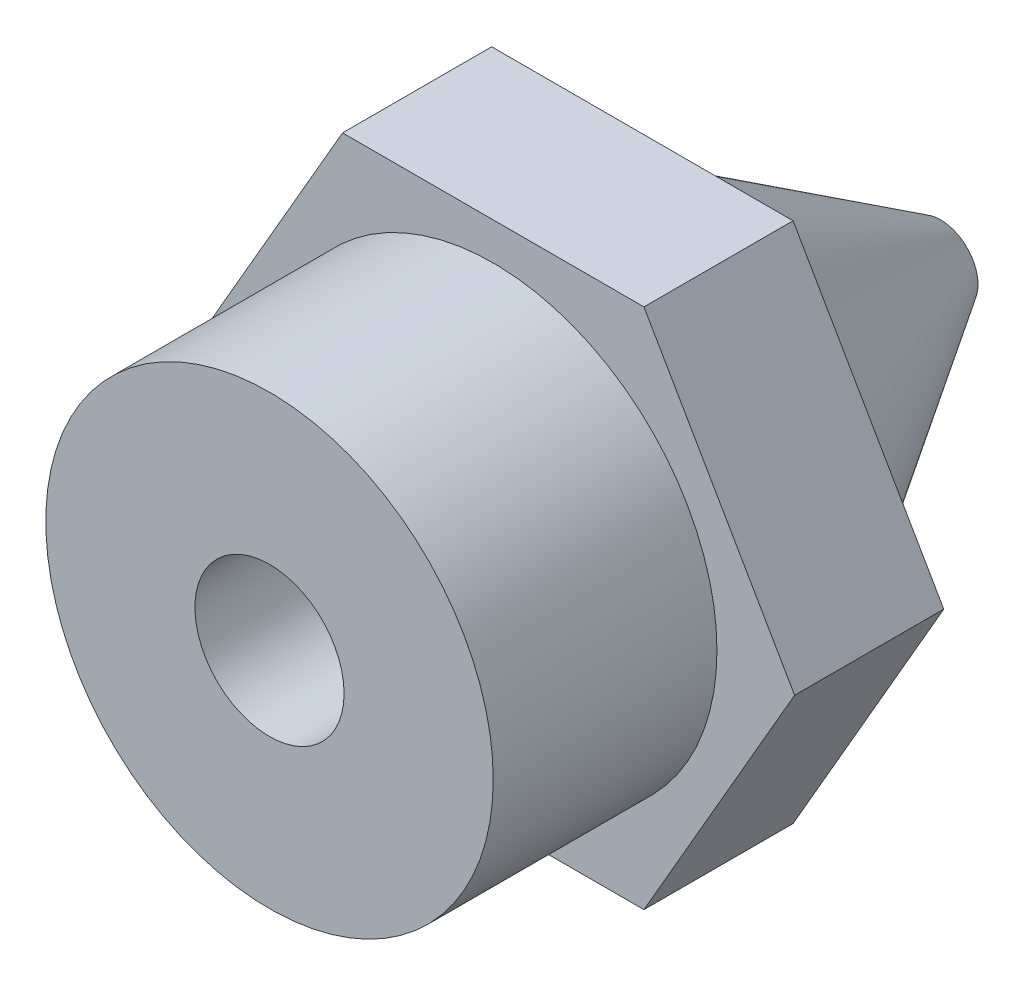
ISO-10303-21;
HEADER;
FILE_DESCRIPTION(('STEP AP214'),'2;1');
FILE_NAME('part.step','',(''),(''),'','','');
FILE_SCHEMA(('AUTOMOTIVE_DESIGN { 1 0 10303 214 1 1 1 1 }'));
ENDSEC;
DATA;
#1=APPLICATION_CONTEXT('core data for automotive mechanical design processes');
#2=APPLICATION_PROTOCOL_DEFINITION('international standard','automotive_design',2000,#1);
#3=PRODUCT_CONTEXT('',#1,'mechanical');
#4=PRODUCT('Part','Part','',(#3));
#5=PRODUCT_RELATED_PRODUCT_CATEGORY('part','',(#4));
#6=PRODUCT_DEFINITION_FORMATION('','',#4);
#7=PRODUCT_DEFINITION_CONTEXT('part definition',#1,'design');
#8=PRODUCT_DEFINITION('design','',#6,#7);
#9=PRODUCT_DEFINITION_SHAPE('','',#8);
#10=(LENGTH_UNIT() NAMED_UNIT(*) SI_UNIT(.MILLI.,.METRE.));
#11=(NAMED_UNIT(*) PLANE_ANGLE_UNIT() SI_UNIT($,.RADIAN.));
#12=(NAMED_UNIT(*) SI_UNIT($,.STERADIAN.) SOLID_ANGLE_UNIT());
#13=UNCERTAINTY_MEASURE_WITH_UNIT(LENGTH_MEASURE(1.E-05),#10,'distance_accuracy_value','');
#14=(GEOMETRIC_REPRESENTATION_CONTEXT(3) GLOBAL_UNCERTAINTY_ASSIGNED_CONTEXT((#13)) GLOBAL_UNIT_ASSIGNED_CONTEXT((#10,
#11,#12)) REPRESENTATION_CONTEXT('',''));
#15=CARTESIAN_POINT('',(0.,0.,0.));
#16=DIRECTION('',(0.,0.,1.));
#17=DIRECTION('',(1.,0.,0.));
#18=AXIS2_PLACEMENT_3D('',#15,#16,#17);
#19=CARTESIAN_POINT('',(2.02072594216373,-3.49999999999998,9.));
#20=DIRECTION('',(-0.866025403784442,0.499999999999995,0.));
#21=DIRECTION('',(-0.499999999999995,-0.866025403784442,0.));
#22=AXIS2_PLACEMENT_3D('',#19,#20,#21);
#23=PLANE('',#22);
#24=DIRECTION('',(-0.499999999999995,-0.866025403784442,0.));
#25=VECTOR('',#24,1.);
#26=CARTESIAN_POINT('',(2.02072594216373,-3.49999999999998,4.));
#27=LINE('',#26,#25);
#28=CARTESIAN_POINT('',(4.04145188432738,0.,4.));
#29=VERTEX_POINT('',#28);
#30=CARTESIAN_POINT('',(2.02072594216373,-3.49999999999998,4.));
#31=VERTEX_POINT('',#30);
#32=EDGE_CURVE('E50',#29,#31,#27,.T.);
#33=ORIENTED_EDGE('',*,*,#32,.F.);
#34=DIRECTION('',(0.,0.,-1.));
#35=VECTOR('',#34,1.);
#36=CARTESIAN_POINT('',(4.04145188432738,0.,9.));
#37=LINE('',#36,#35);
#38=CARTESIAN_POINT('',(4.04145188432738,0.,6.));
#39=VERTEX_POINT('',#38);
#40=EDGE_CURVE('E119',#39,#29,#37,.T.);
#41=ORIENTED_EDGE('',*,*,#40,.F.);
#42=DIRECTION('',(0.499999999999995,0.866025403784442,0.));
#43=VECTOR('',#42,1.);
#44=CARTESIAN_POINT('',(2.02072594216373,-3.49999999999998,6.));
#45=LINE('',#44,#43);
#46=CARTESIAN_POINT('',(2.02072594216373,-3.49999999999998,6.));
#47=VERTEX_POINT('',#46);
#48=EDGE_CURVE('E110',#47,#39,#45,.T.);
#49=ORIENTED_EDGE('',*,*,#48,.F.);
#50=DIRECTION('',(0.,0.,-1.));
#51=VECTOR('',#50,1.);
#52=CARTESIAN_POINT('',(2.02072594216373,-3.49999999999998,9.));
#53=LINE('',#52,#51);
#54=EDGE_CURVE('E106',#47,#31,#53,.T.);
#55=ORIENTED_EDGE('',*,*,#54,.T.);
#56=EDGE_LOOP('',(#33,#41,#49,#55));
#57=FACE_BOUND('',#56,.T.);
#58=ADVANCED_FACE('F34',(#57),#23,.F.);
#59=CARTESIAN_POINT('',(4.04145188432738,0.,9.));
#60=DIRECTION('',(-0.866025403784438,-0.500000000000001,0.));
#61=DIRECTION('',(0.500000000000001,-0.866025403784438,0.));
#62=AXIS2_PLACEMENT_3D('',#59,#60,#61);
#63=PLANE('',#62);
#64=DIRECTION('',(0.500000000000001,-0.866025403784438,0.));
#65=VECTOR('',#64,1.);
#66=CARTESIAN_POINT('',(4.04145188432738,0.,4.));
#67=LINE('',#66,#65);
#68=CARTESIAN_POINT('',(2.02072594216368,3.50000000000001,4.));
#69=VERTEX_POINT('',#68);
#70=EDGE_CURVE('E142',#69,#29,#67,.T.);
#71=ORIENTED_EDGE('',*,*,#70,.F.);
#72=DIRECTION('',(0.,0.,-1.));
#73=VECTOR('',#72,1.);
#74=CARTESIAN_POINT('',(2.02072594216368,3.50000000000001,9.));
#75=LINE('',#74,#73);
#76=CARTESIAN_POINT('',(2.02072594216368,3.50000000000001,6.));
#77=VERTEX_POINT('',#76);
#78=EDGE_CURVE('E116',#77,#69,#75,.T.);
#79=ORIENTED_EDGE('',*,*,#78,.F.);
#80=DIRECTION('',(-0.500000000000001,0.866025403784438,0.));
#81=VECTOR('',#80,1.);
#82=CARTESIAN_POINT('',(4.04145188432738,0.,6.));
#83=LINE('',#82,#81);
#84=EDGE_CURVE('E127',#39,#77,#83,.T.);
#85=ORIENTED_EDGE('',*,*,#84,.F.);
#86=ORIENTED_EDGE('',*,*,#40,.T.);
#87=EDGE_LOOP('',(#71,#79,#85,#86));
#88=FACE_BOUND('',#87,.T.);
#89=ADVANCED_FACE('F182',(#88),#63,.F.);
#90=CARTESIAN_POINT('',(2.02072594216368,3.50000000000001,9.));
#91=DIRECTION('',(0.,-1.,0.));
#92=DIRECTION('',(1.,0.,0.));
#93=AXIS2_PLACEMENT_3D('',#90,#91,#92);
#94=PLANE('',#93);
#95=DIRECTION('',(1.,0.,0.));
#96=VECTOR('',#95,1.);
#97=CARTESIAN_POINT('',(2.02072594216368,3.50000000000001,4.));
#98=LINE('',#97,#96);
#99=CARTESIAN_POINT('',(-2.02072594216371,3.49999999999999,4.));
#100=VERTEX_POINT('',#99);
#101=EDGE_CURVE('E144',#100,#69,#98,.T.);
#102=ORIENTED_EDGE('',*,*,#101,.F.);
#103=DIRECTION('',(0.,0.,-1.));
#104=VECTOR('',#103,1.);
#105=CARTESIAN_POINT('',(-2.02072594216371,3.49999999999999,9.));
#106=LINE('',#105,#104);
#107=CARTESIAN_POINT('',(-2.02072594216371,3.49999999999999,6.));
#108=VERTEX_POINT('',#107);
#109=EDGE_CURVE('E108',#108,#100,#106,.T.);
#110=ORIENTED_EDGE('',*,*,#109,.F.);
#111=DIRECTION('',(-1.,0.,0.));
#112=VECTOR('',#111,1.);
#113=CARTESIAN_POINT('',(2.02072594216368,3.50000000000001,6.));
#114=LINE('',#113,#112);
#115=EDGE_CURVE('E128',#77,#108,#114,.T.);
#116=ORIENTED_EDGE('',*,*,#115,.F.);
#117=ORIENTED_EDGE('',*,*,#78,.T.);
#118=EDGE_LOOP('',(#102,#110,#116,#117));
#119=FACE_BOUND('',#118,.T.);
#120=ADVANCED_FACE('F186',(#119),#94,.F.);
#121=CARTESIAN_POINT('',(-2.02072594216371,3.49999999999999,9.));
#122=DIRECTION('',(0.866025403784441,-0.499999999999995,0.));
#123=DIRECTION('',(0.499999999999995,0.866025403784442,0.));
#124=AXIS2_PLACEMENT_3D('',#121,#122,#123);
#125=PLANE('',#124);
#126=DIRECTION('',(0.499999999999995,0.866025403784442,0.));
#127=VECTOR('',#126,1.);
#128=CARTESIAN_POINT('',(-2.02072594216371,3.49999999999999,4.));
#129=LINE('',#128,#127);
#130=CARTESIAN_POINT('',(-4.04145188432738,0.,4.));
#131=VERTEX_POINT('',#130);
#132=EDGE_CURVE('E102',#131,#100,#129,.T.);
#133=ORIENTED_EDGE('',*,*,#132,.F.);
#134=DIRECTION('',(0.,0.,-1.));
#135=VECTOR('',#134,1.);
#136=CARTESIAN_POINT('',(-4.04145188432738,0.,9.));
#137=LINE('',#136,#135);
#138=CARTESIAN_POINT('',(-4.04145188432738,0.,6.));
#139=VERTEX_POINT('',#138);
#140=EDGE_CURVE('E101',#139,#131,#137,.T.);
#141=ORIENTED_EDGE('',*,*,#140,.F.);
#142=DIRECTION('',(-0.499999999999995,-0.866025403784442,0.));
#143=VECTOR('',#142,1.);
#144=CARTESIAN_POINT('',(-2.02072594216371,3.49999999999999,6.));
#145=LINE('',#144,#143);
#146=EDGE_CURVE('E132',#108,#139,#145,.T.);
#147=ORIENTED_EDGE('',*,*,#146,.F.);
#148=ORIENTED_EDGE('',*,*,#109,.T.);
#149=EDGE_LOOP('',(#133,#141,#147,#148));
#150=FACE_BOUND('',#149,.T.);
#151=ADVANCED_FACE('F192',(#150),#125,.F.);
#152=CARTESIAN_POINT('',(-4.04145188432738,0.,9.));
#153=DIRECTION('',(0.866025403784434,0.500000000000007,0.));
#154=DIRECTION('',(-0.500000000000007,0.866025403784435,0.));
#155=AXIS2_PLACEMENT_3D('',#152,#153,#154);
#156=PLANE('',#155);
#157=DIRECTION('',(-0.500000000000007,0.866025403784435,0.));
#158=VECTOR('',#157,1.);
#159=CARTESIAN_POINT('',(-4.04145188432738,0.,4.));
#160=LINE('',#159,#158);
#161=CARTESIAN_POINT('',(-2.02072594216366,-3.50000000000002,4.));
#162=VERTEX_POINT('',#161);
#163=EDGE_CURVE('E87',#162,#131,#160,.T.);
#164=ORIENTED_EDGE('',*,*,#163,.F.);
#165=DIRECTION('',(0.,0.,-1.));
#166=VECTOR('',#165,1.);
#167=CARTESIAN_POINT('',(-2.02072594216366,-3.50000000000002,9.));
#168=LINE('',#167,#166);
#169=CARTESIAN_POINT('',(-2.02072594216366,-3.50000000000002,6.));
#170=VERTEX_POINT('',#169);
#171=EDGE_CURVE('E99',#170,#162,#168,.T.);
#172=ORIENTED_EDGE('',*,*,#171,.F.);
#173=DIRECTION('',(0.500000000000007,-0.866025403784435,0.));
#174=VECTOR('',#173,1.);
#175=CARTESIAN_POINT('',(-4.04145188432738,0.,6.));
#176=LINE('',#175,#174);
#177=EDGE_CURVE('E58',#139,#170,#176,.T.);
#178=ORIENTED_EDGE('',*,*,#177,.F.);
#179=ORIENTED_EDGE('',*,*,#140,.T.);
#180=EDGE_LOOP('',(#164,#172,#178,#179));
#181=FACE_BOUND('',#180,.T.);
#182=ADVANCED_FACE('F98',(#181),#156,.F.);
#183=CARTESIAN_POINT('',(-2.02072594216366,-3.50000000000002,9.));
#184=DIRECTION('',(0.,1.,0.));
#185=DIRECTION('',(-1.,0.,0.));
#186=AXIS2_PLACEMENT_3D('',#183,#184,#185);
#187=PLANE('',#186);
#188=DIRECTION('',(-1.,0.,0.));
#189=VECTOR('',#188,1.);
#190=CARTESIAN_POINT('',(-2.02072594216366,-3.50000000000002,4.));
#191=LINE('',#190,#189);
#192=EDGE_CURVE('E43',#31,#162,#191,.T.);
#193=ORIENTED_EDGE('',*,*,#192,.F.);
#194=ORIENTED_EDGE('',*,*,#54,.F.);
#195=DIRECTION('',(1.,0.,0.));
#196=VECTOR('',#195,1.);
#197=CARTESIAN_POINT('',(-2.02072594216366,-3.50000000000002,6.));
#198=LINE('',#197,#196);
#199=EDGE_CURVE('E93',#170,#47,#198,.T.);
#200=ORIENTED_EDGE('',*,*,#199,.F.);
#201=ORIENTED_EDGE('',*,*,#171,.T.);
#202=EDGE_LOOP('',(#193,#194,#200,#201));
#203=FACE_BOUND('',#202,.T.);
#204=ADVANCED_FACE('F105',(#203),#187,.F.);
#205=CARTESIAN_POINT('',(0.,0.,6.));
#206=DIRECTION('',(0.,0.,1.));
#207=DIRECTION('',(1.,0.,0.));
#208=AXIS2_PLACEMENT_3D('',#205,#206,#207);
#209=PLANE('',#208);
#210=CARTESIAN_POINT('',(0.,0.,6.));
#211=DIRECTION('',(0.,0.,1.));
#212=DIRECTION('',(1.,0.,0.));
#213=AXIS2_PLACEMENT_3D('',#210,#211,#212);
#214=CIRCLE('',#213,3.);
#215=CARTESIAN_POINT('',(3.,0.,6.));
#216=VERTEX_POINT('',#215);
#217=EDGE_CURVE('E135',#216,#216,#214,.T.);
#218=ORIENTED_EDGE('',*,*,#217,.F.);
#219=EDGE_LOOP('',(#218));
#220=FACE_BOUND('',#219,.T.);
#221=ORIENTED_EDGE('',*,*,#48,.T.);
#222=ORIENTED_EDGE('',*,*,#84,.T.);
#223=ORIENTED_EDGE('',*,*,#115,.T.);
#224=ORIENTED_EDGE('',*,*,#146,.T.);
#225=ORIENTED_EDGE('',*,*,#177,.T.);
#226=ORIENTED_EDGE('',*,*,#199,.T.);
#227=EDGE_LOOP('',(#221,#222,#223,#224,#225,#226));
#228=FACE_BOUND('',#227,.T.);
#229=ADVANCED_FACE('F123',(#220,#228),#209,.T.);
#230=CARTESIAN_POINT('',(0.,0.,6.));
#231=DIRECTION('',(0.,0.,1.));
#232=DIRECTION('',(1.,0.,0.));
#233=AXIS2_PLACEMENT_3D('',#230,#231,#232);
#234=CYLINDRICAL_SURFACE('',#233,3.);
#235=ORIENTED_EDGE('',*,*,#217,.T.);
#236=EDGE_LOOP('',(#235));
#237=FACE_BOUND('',#236,.T.);
#238=CARTESIAN_POINT('',(0.,0.,9.));
#239=DIRECTION('',(0.,0.,1.));
#240=DIRECTION('',(1.,0.,0.));
#241=AXIS2_PLACEMENT_3D('',#238,#239,#240);
#242=CIRCLE('',#241,3.);
#243=CARTESIAN_POINT('',(3.,0.,9.));
#244=VERTEX_POINT('',#243);
#245=EDGE_CURVE('E136',#244,#244,#242,.T.);
#246=ORIENTED_EDGE('',*,*,#245,.F.);
#247=EDGE_LOOP('',(#246));
#248=FACE_BOUND('',#247,.T.);
#249=ADVANCED_FACE('F168',(#237,#248),#234,.T.);
#250=CARTESIAN_POINT('',(0.,0.,9.));
#251=DIRECTION('',(0.,0.,1.));
#252=DIRECTION('',(1.,0.,0.));
#253=AXIS2_PLACEMENT_3D('',#250,#251,#252);
#254=PLANE('',#253);
#255=CARTESIAN_POINT('',(0.,0.,9.));
#256=DIRECTION('',(0.,0.,1.));
#257=DIRECTION('',(1.,0.,0.));
#258=AXIS2_PLACEMENT_3D('',#255,#256,#257);
#259=CIRCLE('',#258,1.);
#260=CARTESIAN_POINT('',(1.,0.,9.));
#261=VERTEX_POINT('',#260);
#262=EDGE_CURVE('E149',#261,#261,#259,.T.);
#263=ORIENTED_EDGE('',*,*,#262,.F.);
#264=EDGE_LOOP('',(#263));
#265=FACE_BOUND('',#264,.T.);
#266=ORIENTED_EDGE('',*,*,#245,.T.);
#267=EDGE_LOOP('',(#266));
#268=FACE_BOUND('',#267,.T.);
#269=ADVANCED_FACE('F165',(#265,#268),#254,.T.);
#270=CARTESIAN_POINT('',(0.,0.,4.));
#271=DIRECTION('',(0.,0.,-1.));
#272=DIRECTION('',(-1.,0.,0.));
#273=AXIS2_PLACEMENT_3D('',#270,#271,#272);
#274=PLANE('',#273);
#275=CARTESIAN_POINT('',(0.,0.,4.));
#276=DIRECTION('',(0.,0.,-1.));
#277=DIRECTION('',(-1.,0.,0.));
#278=AXIS2_PLACEMENT_3D('',#275,#276,#277);
#279=CIRCLE('',#278,3.);
#280=CARTESIAN_POINT('',(2.99999999999999,0.,4.));
#281=VERTEX_POINT('',#280);
#282=EDGE_CURVE('E103',#281,#281,#279,.T.);
#283=ORIENTED_EDGE('',*,*,#282,.F.);
#284=EDGE_LOOP('',(#283));
#285=FACE_BOUND('',#284,.T.);
#286=ORIENTED_EDGE('',*,*,#32,.T.);
#287=ORIENTED_EDGE('',*,*,#192,.T.);
#288=ORIENTED_EDGE('',*,*,#163,.T.);
#289=ORIENTED_EDGE('',*,*,#132,.T.);
#290=ORIENTED_EDGE('',*,*,#101,.T.);
#291=ORIENTED_EDGE('',*,*,#70,.T.);
#292=EDGE_LOOP('',(#286,#287,#288,#289,#290,#291));
#293=FACE_BOUND('',#292,.T.);
#294=ADVANCED_FACE('F86',(#285,#293),#274,.T.);
#295=CARTESIAN_POINT('',(0.,0.,0.));
#296=DIRECTION('',(0.,0.,1.));
#297=DIRECTION('',(1.,0.,0.));
#298=AXIS2_PLACEMENT_3D('',#295,#296,#297);
#299=PLANE('',#298);
#300=CARTESIAN_POINT('',(0.,0.,0.));
#301=DIRECTION('',(0.,0.,1.));
#302=DIRECTION('',(1.,0.,0.));
#303=AXIS2_PLACEMENT_3D('',#300,#301,#302);
#304=CIRCLE('',#303,0.175000000000001);
#305=CARTESIAN_POINT('',(0.175000000000001,0.,0.));
#306=VERTEX_POINT('',#305);
#307=EDGE_CURVE('E38',#306,#306,#304,.T.);
#308=ORIENTED_EDGE('',*,*,#307,.T.);
#309=EDGE_LOOP('',(#308));
#310=FACE_BOUND('',#309,.T.);
#311=CARTESIAN_POINT('',(0.,0.,0.));
#312=DIRECTION('',(0.,0.,1.));
#313=DIRECTION('',(1.,0.,0.));
#314=AXIS2_PLACEMENT_3D('',#311,#312,#313);
#315=CIRCLE('',#314,0.50052259236269);
#316=CARTESIAN_POINT('',(0.50052259236269,0.,0.));
#317=VERTEX_POINT('',#316);
#318=EDGE_CURVE('E11',#317,#317,#315,.F.);
#319=ORIENTED_EDGE('',*,*,#318,.T.);
#320=EDGE_LOOP('',(#319));
#321=FACE_BOUND('',#320,.T.);
#322=ADVANCED_FACE('F201',(#310,#321),#299,.F.);
#323=CARTESIAN_POINT('',(0.,0.,0.));
#324=DIRECTION('',(0.,0.,1.));
#325=DIRECTION('',(1.,0.,0.));
#326=AXIS2_PLACEMENT_3D('',#323,#324,#325);
#327=CONICAL_SURFACE('',#326,0.50052259236269,0.558505360638183);
#328=CARTESIAN_POINT('',(2.99999999999999,0.,4.));
#329=CARTESIAN_POINT('',(2.97396377700376,0.,3.95833333333333));
#330=CARTESIAN_POINT('',(2.94792755400754,0.,3.91666666666667));
#331=CARTESIAN_POINT('',(2.8958551080151,0.,3.83333333333333));
#332=CARTESIAN_POINT('',(2.86981888501888,0.,3.79166666666667));
#333=CARTESIAN_POINT('',(2.81774643902643,0.,3.70833333333333));
#334=CARTESIAN_POINT('',(2.79171021603021,0.,3.66666666666667));
#335=CARTESIAN_POINT('',(2.73963777003777,0.,3.58333333333333));
#336=CARTESIAN_POINT('',(2.71360154704155,0.,3.54166666666667));
#337=CARTESIAN_POINT('',(2.6615291010491,0.,3.45833333333333));
#338=CARTESIAN_POINT('',(2.63549287805288,0.,3.41666666666667));
#339=CARTESIAN_POINT('',(2.58342043206044,0.,3.33333333333333));
#340=CARTESIAN_POINT('',(2.55738420906421,0.,3.29166666666667));
#341=CARTESIAN_POINT('',(2.50531176307177,0.,3.20833333333333));
#342=CARTESIAN_POINT('',(2.47927554007555,0.,3.16666666666667));
#343=CARTESIAN_POINT('',(2.42720309408311,0.,3.08333333333333));
#344=CARTESIAN_POINT('',(2.40116687108688,0.,3.04166666666667));
#345=CARTESIAN_POINT('',(2.34909442509444,0.,2.95833333333333));
#346=CARTESIAN_POINT('',(2.32305820209822,0.,2.91666666666667));
#347=CARTESIAN_POINT('',(2.27098575610577,0.,2.83333333333333));
#348=CARTESIAN_POINT('',(2.24494953310955,0.,2.79166666666667));
#349=CARTESIAN_POINT('',(2.19287708711711,0.,2.70833333333333));
#350=CARTESIAN_POINT('',(2.16684086412089,0.,2.66666666666667));
#351=CARTESIAN_POINT('',(2.11476841812844,0.,2.58333333333333));
#352=CARTESIAN_POINT('',(2.08873219513222,0.,2.54166666666667));
#353=CARTESIAN_POINT('',(2.03665974913978,0.,2.45833333333333));
#354=CARTESIAN_POINT('',(2.01062352614356,0.,2.41666666666667));
#355=CARTESIAN_POINT('',(1.95855108015111,0.,2.33333333333333));
#356=CARTESIAN_POINT('',(1.93251485715489,0.,2.29166666666667));
#357=CARTESIAN_POINT('',(1.88044241116245,0.,2.20833333333333));
#358=CARTESIAN_POINT('',(1.85440618816623,0.,2.16666666666667));
#359=CARTESIAN_POINT('',(1.80233374217378,0.,2.08333333333333));
#360=CARTESIAN_POINT('',(1.77629751917756,0.,2.04166666666667));
#361=CARTESIAN_POINT('',(1.72422507318512,0.,1.95833333333333));
#362=CARTESIAN_POINT('',(1.69818885018889,0.,1.91666666666667));
#363=CARTESIAN_POINT('',(1.64611640419645,0.,1.83333333333333));
#364=CARTESIAN_POINT('',(1.62008018120023,0.,1.79166666666667));
#365=CARTESIAN_POINT('',(1.56800773520778,0.,1.70833333333333));
#366=CARTESIAN_POINT('',(1.54197151221156,0.,1.66666666666667));
#367=CARTESIAN_POINT('',(1.48989906621912,0.,1.58333333333333));
#368=CARTESIAN_POINT('',(1.4638628432229,0.,1.54166666666667));
#369=CARTESIAN_POINT('',(1.41179039723045,0.,1.45833333333333));
#370=CARTESIAN_POINT('',(1.38575417423423,0.,1.41666666666667));
#371=CARTESIAN_POINT('',(1.33368172824179,0.,1.33333333333333));
#372=CARTESIAN_POINT('',(1.30764550524557,0.,1.29166666666667));
#373=CARTESIAN_POINT('',(1.25557305925312,0.,1.20833333333333));
#374=CARTESIAN_POINT('',(1.2295368362569,0.,1.16666666666667));
#375=CARTESIAN_POINT('',(1.17746439026446,0.,1.08333333333333));
#376=CARTESIAN_POINT('',(1.15142816726824,0.,1.04166666666667));
#377=CARTESIAN_POINT('',(1.09935572127579,0.,0.958333333333333));
#378=CARTESIAN_POINT('',(1.07331949827957,0.,0.916666666666667));
#379=CARTESIAN_POINT('',(1.02124705228713,0.,0.833333333333333));
#380=CARTESIAN_POINT('',(0.995210829290905,0.,0.791666666666667));
#381=CARTESIAN_POINT('',(0.943138383298461,0.,0.708333333333333));
#382=CARTESIAN_POINT('',(0.917102160302239,0.,0.666666666666667));
#383=CARTESIAN_POINT('',(0.865029714309796,0.,0.583333333333333));
#384=CARTESIAN_POINT('',(0.838993491313574,0.,0.541666666666667));
#385=CARTESIAN_POINT('',(0.78692104532113,0.,0.458333333333333));
#386=CARTESIAN_POINT('',(0.760884822324908,0.,0.416666666666667));
#387=CARTESIAN_POINT('',(0.708812376332465,0.,0.333333333333333));
#388=CARTESIAN_POINT('',(0.682776153336243,0.,0.291666666666667));
#389=CARTESIAN_POINT('',(0.630703707343799,0.,0.208333333333333));
#390=CARTESIAN_POINT('',(0.604667484347577,0.,0.166666666666667));
#391=CARTESIAN_POINT('',(0.552595038355134,0.,0.0833333333333335));
#392=CARTESIAN_POINT('',(0.526558815358912,0.,0.0416666666666668));
#393=CARTESIAN_POINT('',(0.50052259236269,0.,0.));
#394=B_SPLINE_CURVE_WITH_KNOTS('',3,(#328,#329,#330,#331,#332,#333,#334,#335,#336,#337,#338,
#339,#340,#341,#342,#343,#344,#345,#346,#347,#348,#349,#350,#351,#352,#353,#354,#355,#356,#357,
#358,#359,#360,#361,#362,#363,#364,#365,#366,#367,#368,#369,#370,#371,#372,#373,#374,#375,#376,
#377,#378,#379,#380,#381,#382,#383,#384,#385,#386,#387,#388,#389,#390,#391,#392,#393),
.UNSPECIFIED.,.F.,.F.,(4,2,2,2,2,2,2,2,2,2,2,2,2,2,2,2,2,2,2,2,2,2,2,2,2,2,2,2,2,2,2,2,4),(0.,
0.147397300420262,0.294794600840524,0.442191901260785,0.589589201681047,0.736986502101309,
0.884383802521571,1.03178110294183,1.17917840336209,1.32657570378236,1.47397300420262,
1.62137030462288,1.76876760504314,1.9161649054634,2.06356220588366,2.21095950630393,
2.35835680672419,2.50575410714445,2.65315140756471,2.80054870798497,2.94794600840524,
3.0953433088255,3.24274060924576,3.39013790966602,3.53753521008628,3.68493251050655,
3.83232981092681,3.97972711134707,4.12712441176733,4.27452171218759,4.42191901260786,
4.56931631302812,4.71671361344838),.UNSPECIFIED.);
#395=EDGE_CURVE('BSEAM36',#281,#317,#394,.T.);
#396=ORIENTED_EDGE('',*,*,#282,.T.);
#397=ORIENTED_EDGE('',*,*,#318,.F.);
#398=ORIENTED_EDGE('',*,*,#395,.T.);
#399=ORIENTED_EDGE('',*,*,#395,.F.);
#400=EDGE_LOOP('',(#396,#398,#397,#399));
#401=FACE_BOUND('',#400,.T.);
#402=ADVANCED_FACE('F36',(#401),#327,.T.);
#403=CARTESIAN_POINT('',(0.,0.,6.6));
#404=DIRECTION('',(0.,0.,1.));
#405=DIRECTION('',(1.,0.,0.));
#406=AXIS2_PLACEMENT_3D('',#403,#404,#405);
#407=CONICAL_SURFACE('',#406,1.,0.124354994546762);
#408=CARTESIAN_POINT('',(0.,0.,6.6));
#409=DIRECTION('',(0.,0.,1.));
#410=DIRECTION('',(1.,0.,0.));
#411=AXIS2_PLACEMENT_3D('',#408,#409,#410);
#412=CIRCLE('',#411,1.);
#413=CARTESIAN_POINT('',(1.,0.,6.6));
#414=VERTEX_POINT('',#413);
#415=EDGE_CURVE('E152',#414,#414,#412,.T.);
#416=CARTESIAN_POINT('',(1.,0.,6.6));
#417=CARTESIAN_POINT('',(0.991406250000002,0.,6.53125));
#418=CARTESIAN_POINT('',(0.982812500000002,0.,6.4625));
#419=CARTESIAN_POINT('',(0.965625000000002,0.,6.325));
#420=CARTESIAN_POINT('',(0.957031250000002,0.,6.25625));
#421=CARTESIAN_POINT('',(0.939843750000002,0.,6.11875));
#422=CARTESIAN_POINT('',(0.931250000000002,0.,6.05));
#423=CARTESIAN_POINT('',(0.914062500000002,0.,5.9125));
#424=CARTESIAN_POINT('',(0.905468750000002,0.,5.84375));
#425=CARTESIAN_POINT('',(0.888281250000002,0.,5.70625));
#426=CARTESIAN_POINT('',(0.879687500000002,0.,5.6375));
#427=CARTESIAN_POINT('',(0.862500000000002,0.,5.5));
#428=CARTESIAN_POINT('',(0.853906250000002,0.,5.43125));
#429=CARTESIAN_POINT('',(0.836718750000002,0.,5.29375));
#430=CARTESIAN_POINT('',(0.828125000000002,0.,5.225));
#431=CARTESIAN_POINT('',(0.810937500000002,0.,5.0875));
#432=CARTESIAN_POINT('',(0.802343750000002,0.,5.01875));
#433=CARTESIAN_POINT('',(0.785156250000002,0.,4.88125));
#434=CARTESIAN_POINT('',(0.776562500000002,0.,4.8125));
#435=CARTESIAN_POINT('',(0.759375000000002,0.,4.675));
#436=CARTESIAN_POINT('',(0.750781250000002,0.,4.60625));
#437=CARTESIAN_POINT('',(0.733593750000002,0.,4.46875));
#438=CARTESIAN_POINT('',(0.725000000000002,0.,4.4));
#439=CARTESIAN_POINT('',(0.707812500000002,0.,4.2625));
#440=CARTESIAN_POINT('',(0.699218750000002,0.,4.19375));
#441=CARTESIAN_POINT('',(0.682031250000002,0.,4.05625));
#442=CARTESIAN_POINT('',(0.673437500000002,0.,3.9875));
#443=CARTESIAN_POINT('',(0.656250000000002,0.,3.85));
#444=CARTESIAN_POINT('',(0.647656250000002,0.,3.78125));
#445=CARTESIAN_POINT('',(0.630468750000002,0.,3.64375));
#446=CARTESIAN_POINT('',(0.621875000000002,0.,3.575));
#447=CARTESIAN_POINT('',(0.604687500000001,0.,3.4375));
#448=CARTESIAN_POINT('',(0.596093750000001,0.,3.36875));
#449=CARTESIAN_POINT('',(0.578906250000001,0.,3.23125));
#450=CARTESIAN_POINT('',(0.570312500000001,0.,3.1625));
#451=CARTESIAN_POINT('',(0.553125000000001,0.,3.025));
#452=CARTESIAN_POINT('',(0.544531250000001,0.,2.95625));
#453=CARTESIAN_POINT('',(0.527343750000001,0.,2.81875));
#454=CARTESIAN_POINT('',(0.518750000000001,0.,2.75));
#455=CARTESIAN_POINT('',(0.501562500000001,0.,2.6125));
#456=CARTESIAN_POINT('',(0.492968750000001,0.,2.54375));
#457=CARTESIAN_POINT('',(0.475781250000001,0.,2.40625));
#458=CARTESIAN_POINT('',(0.467187500000001,0.,2.3375));
#459=CARTESIAN_POINT('',(0.450000000000001,0.,2.2));
#460=CARTESIAN_POINT('',(0.441406250000001,0.,2.13125));
#461=CARTESIAN_POINT('',(0.424218750000001,0.,1.99375));
#462=CARTESIAN_POINT('',(0.415625000000001,0.,1.925));
#463=CARTESIAN_POINT('',(0.398437500000001,0.,1.7875));
#464=CARTESIAN_POINT('',(0.389843750000001,0.,1.71875));
#465=CARTESIAN_POINT('',(0.372656250000001,0.,1.58125));
#466=CARTESIAN_POINT('',(0.364062500000001,0.,1.5125));
#467=CARTESIAN_POINT('',(0.346875000000001,0.,1.375));
#468=CARTESIAN_POINT('',(0.338281250000001,0.,1.30625));
#469=CARTESIAN_POINT('',(0.321093750000001,0.,1.16875));
#470=CARTESIAN_POINT('',(0.312500000000001,0.,1.1));
#471=CARTESIAN_POINT('',(0.295312500000001,0.,0.9625));
#472=CARTESIAN_POINT('',(0.286718750000001,0.,0.89375));
#473=CARTESIAN_POINT('',(0.269531250000001,0.,0.75625));
#474=CARTESIAN_POINT('',(0.260937500000001,0.,0.6875));
#475=CARTESIAN_POINT('',(0.243750000000001,0.,0.55));
#476=CARTESIAN_POINT('',(0.235156250000001,0.,0.48125));
#477=CARTESIAN_POINT('',(0.217968750000001,0.,0.34375));
#478=CARTESIAN_POINT('',(0.209375000000001,0.,0.275));
#479=CARTESIAN_POINT('',(0.192187500000001,0.,0.1375));
#480=CARTESIAN_POINT('',(0.183593750000001,0.,0.0687499999999999));
#481=CARTESIAN_POINT('',(0.175000000000001,0.,0.));
#482=B_SPLINE_CURVE_WITH_KNOTS('',3,(#416,#417,#418,#419,#420,#421,#422,#423,#424,#425,#426,
#427,#428,#429,#430,#431,#432,#433,#434,#435,#436,#437,#438,#439,#440,#441,#442,#443,#444,#445,
#446,#447,#448,#449,#450,#451,#452,#453,#454,#455,#456,#457,#458,#459,#460,#461,#462,#463,#464,
#465,#466,#467,#468,#469,#470,#471,#472,#473,#474,#475,#476,#477,#478,#479,#480,#481),
.UNSPECIFIED.,.F.,.F.,(4,2,2,2,2,2,2,2,2,2,2,2,2,2,2,2,2,2,2,2,2,2,2,2,2,2,2,2,2,2,2,2,4),(0.,
0.207855082573322,0.415710165146644,0.623565247719965,0.831420330293287,1.03927541286661,
1.24713049543993,1.45498557801325,1.66284066058658,1.8706957431599,2.07855082573322,
2.28640590830654,2.49426099087986,2.70211607345318,2.90997115602651,3.11782623859983,
3.32568132117315,3.53353640374647,3.74139148631979,3.94924656889312,4.15710165146644,
4.36495673403976,4.57281181661308,4.78066689918641,4.98852198175973,5.19637706433305,
5.40423214690637,5.61208722947969,5.81994231205302,6.02779739462634,6.23565247719966,
6.44350755977298,6.65136264234631),.UNSPECIFIED.);
#483=EDGE_CURVE('BSEAM156',#414,#306,#482,.T.);
#484=ORIENTED_EDGE('',*,*,#415,.T.);
#485=ORIENTED_EDGE('',*,*,#307,.F.);
#486=ORIENTED_EDGE('',*,*,#483,.T.);
#487=ORIENTED_EDGE('',*,*,#483,.F.);
#488=EDGE_LOOP('',(#484,#486,#485,#487));
#489=FACE_BOUND('',#488,.T.);
#490=ADVANCED_FACE('F156',(#489),#407,.F.);
#491=CARTESIAN_POINT('',(0.,0.,9.));
#492=DIRECTION('',(0.,0.,1.));
#493=DIRECTION('',(1.,0.,0.));
#494=AXIS2_PLACEMENT_3D('',#491,#492,#493);
#495=CYLINDRICAL_SURFACE('',#494,1.);
#496=ORIENTED_EDGE('',*,*,#415,.F.);
#497=EDGE_LOOP('',(#496));
#498=FACE_BOUND('',#497,.T.);
#499=ORIENTED_EDGE('',*,*,#262,.T.);
#500=EDGE_LOOP('',(#499));
#501=FACE_BOUND('',#500,.T.);
#502=ADVANCED_FACE('F159',(#498,#501),#495,.F.);
#503=CLOSED_SHELL('',(#58,#89,#120,#151,#182,#204,#229,#249,#269,#294,#322,#402,#490,#502));
#504=MANIFOLD_SOLID_BREP('B2',#503);
#505=ADVANCED_BREP_SHAPE_REPRESENTATION('',(#18,#504),#14);
#506=SHAPE_DEFINITION_REPRESENTATION(#9,#505);
ENDSEC;
END-ISO-10303-21;
